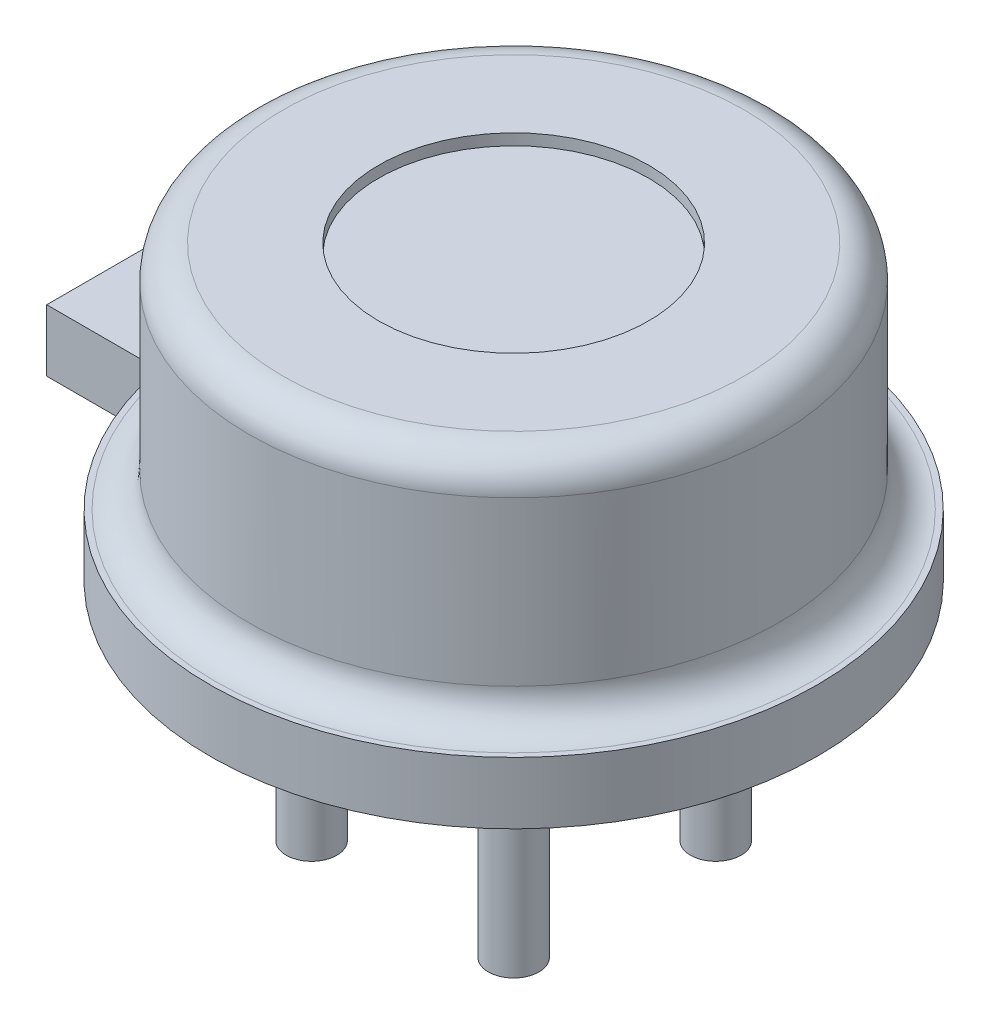
ISO-10303-21;
HEADER;
FILE_DESCRIPTION(('STEP AP214'),'2;1');
FILE_NAME('part.step','',(''),(''),'','','');
FILE_SCHEMA(('AUTOMOTIVE_DESIGN { 1 0 10303 214 1 1 1 1 }'));
ENDSEC;
DATA;
#1=APPLICATION_CONTEXT('core data for automotive mechanical design processes');
#2=APPLICATION_PROTOCOL_DEFINITION('international standard','automotive_design',2000,#1);
#3=PRODUCT_CONTEXT('',#1,'mechanical');
#4=PRODUCT('Part','Part','',(#3));
#5=PRODUCT_RELATED_PRODUCT_CATEGORY('part','',(#4));
#6=PRODUCT_DEFINITION_FORMATION('','',#4);
#7=PRODUCT_DEFINITION_CONTEXT('part definition',#1,'design');
#8=PRODUCT_DEFINITION('design','',#6,#7);
#9=PRODUCT_DEFINITION_SHAPE('','',#8);
#10=(LENGTH_UNIT() NAMED_UNIT(*) SI_UNIT(.MILLI.,.METRE.));
#11=(NAMED_UNIT(*) PLANE_ANGLE_UNIT() SI_UNIT($,.RADIAN.));
#12=(NAMED_UNIT(*) SI_UNIT($,.STERADIAN.) SOLID_ANGLE_UNIT());
#13=UNCERTAINTY_MEASURE_WITH_UNIT(LENGTH_MEASURE(1.E-05),#10,'distance_accuracy_value','');
#14=(GEOMETRIC_REPRESENTATION_CONTEXT(3) GLOBAL_UNCERTAINTY_ASSIGNED_CONTEXT((#13)) GLOBAL_UNIT_ASSIGNED_CONTEXT((#10,
#11,#12)) REPRESENTATION_CONTEXT('',''));
#15=CARTESIAN_POINT('',(0.,0.,0.));
#16=DIRECTION('',(0.,0.,1.));
#17=DIRECTION('',(1.,0.,0.));
#18=AXIS2_PLACEMENT_3D('',#15,#16,#17);
#19=CARTESIAN_POINT('',(0.,2.6,0.));
#20=DIRECTION('',(0.,-1.,0.));
#21=DIRECTION('',(0.,0.,-1.));
#22=AXIS2_PLACEMENT_3D('',#19,#20,#21);
#23=CYLINDRICAL_SURFACE('',#22,2.35);
#24=CARTESIAN_POINT('',(0.,2.3,0.));
#25=DIRECTION('',(0.,1.,0.));
#26=DIRECTION('',(0.,0.,1.));
#27=AXIS2_PLACEMENT_3D('',#24,#25,#26);
#28=CIRCLE('',#27,2.35);
#29=CARTESIAN_POINT('',(0.,2.3,2.35));
#30=VERTEX_POINT('',#29);
#31=EDGE_CURVE('E149',#30,#30,#28,.F.);
#32=ORIENTED_EDGE('',*,*,#31,.T.);
#33=EDGE_LOOP('',(#32));
#34=FACE_BOUND('',#33,.T.);
#35=CARTESIAN_POINT('',(0.,0.85,0.));
#36=DIRECTION('',(0.,-1.,0.));
#37=DIRECTION('',(0.,0.,-1.));
#38=AXIS2_PLACEMENT_3D('',#35,#36,#37);
#39=CIRCLE('',#38,2.35);
#40=CARTESIAN_POINT('',(0.,0.85,-2.35));
#41=VERTEX_POINT('',#40);
#42=EDGE_CURVE('E141',#41,#41,#39,.F.);
#43=ORIENTED_EDGE('',*,*,#42,.T.);
#44=EDGE_LOOP('',(#43));
#45=FACE_BOUND('',#44,.T.);
#46=ADVANCED_FACE('F41',(#34,#45),#23,.T.);
#47=CARTESIAN_POINT('',(0.,2.6,0.));
#48=DIRECTION('',(0.,1.,0.));
#49=DIRECTION('',(0.,0.,1.));
#50=AXIS2_PLACEMENT_3D('',#47,#48,#49);
#51=PLANE('',#50);
#52=CARTESIAN_POINT('',(0.,2.6,0.));
#53=DIRECTION('',(0.,1.,0.));
#54=DIRECTION('',(0.,0.,1.));
#55=AXIS2_PLACEMENT_3D('',#52,#53,#54);
#56=CIRCLE('',#55,1.2);
#57=CARTESIAN_POINT('',(0.,2.6,1.2));
#58=VERTEX_POINT('',#57);
#59=EDGE_CURVE('E125',#58,#58,#56,.T.);
#60=ORIENTED_EDGE('',*,*,#59,.F.);
#61=EDGE_LOOP('',(#60));
#62=FACE_BOUND('',#61,.T.);
#63=CARTESIAN_POINT('',(0.,2.6,0.));
#64=DIRECTION('',(0.,1.,0.));
#65=DIRECTION('',(0.,0.,1.));
#66=AXIS2_PLACEMENT_3D('',#63,#64,#65);
#67=CIRCLE('',#66,2.05);
#68=CARTESIAN_POINT('',(0.,2.6,2.05));
#69=VERTEX_POINT('',#68);
#70=EDGE_CURVE('E145',#69,#69,#67,.T.);
#71=ORIENTED_EDGE('',*,*,#70,.T.);
#72=EDGE_LOOP('',(#71));
#73=FACE_BOUND('',#72,.T.);
#74=ADVANCED_FACE('F192',(#62,#73),#51,.T.);
#75=CARTESIAN_POINT('',(0.,0.55,0.));
#76=DIRECTION('',(0.,-1.,0.));
#77=DIRECTION('',(0.,0.,-1.));
#78=AXIS2_PLACEMENT_3D('',#75,#76,#77);
#79=CYLINDRICAL_SURFACE('',#78,2.7);
#80=DIRECTION('',(0.,-1.,0.));
#81=VECTOR('',#80,1.);
#82=CARTESIAN_POINT('',(-2.65329983228432,0.55,-0.5));
#83=LINE('',#82,#81);
#84=CARTESIAN_POINT('',(-2.65329983228432,0.55,-0.5));
#85=VERTEX_POINT('',#84);
#86=CARTESIAN_POINT('',(-2.65329983228432,0.,-0.5));
#87=VERTEX_POINT('',#86);
#88=EDGE_CURVE('E122',#85,#87,#83,.T.);
#89=ORIENTED_EDGE('',*,*,#88,.F.);
#90=CARTESIAN_POINT('',(0.,0.55,0.));
#91=DIRECTION('',(0.,-1.,0.));
#92=DIRECTION('',(0.,0.,-1.));
#93=AXIS2_PLACEMENT_3D('',#90,#91,#92);
#94=CIRCLE('',#93,2.7);
#95=CARTESIAN_POINT('',(-2.65329983228432,0.55,0.5));
#96=VERTEX_POINT('',#95);
#97=EDGE_CURVE('E57',#85,#96,#94,.T.);
#98=ORIENTED_EDGE('',*,*,#97,.T.);
#99=DIRECTION('',(0.,-1.,0.));
#100=VECTOR('',#99,1.);
#101=CARTESIAN_POINT('',(-2.65329983228432,0.55,0.5));
#102=LINE('',#101,#100);
#103=CARTESIAN_POINT('',(-2.65329983228432,0.,0.5));
#104=VERTEX_POINT('',#103);
#105=EDGE_CURVE('E118',#104,#96,#102,.F.);
#106=ORIENTED_EDGE('',*,*,#105,.F.);
#107=CARTESIAN_POINT('',(0.,0.,0.));
#108=DIRECTION('',(0.,-1.,0.));
#109=DIRECTION('',(0.,0.,-1.));
#110=AXIS2_PLACEMENT_3D('',#107,#108,#109);
#111=CIRCLE('',#110,2.7);
#112=EDGE_CURVE('E62',#87,#104,#111,.T.);
#113=ORIENTED_EDGE('',*,*,#112,.F.);
#114=EDGE_LOOP('',(#89,#98,#106,#113));
#115=FACE_BOUND('',#114,.T.);
#116=ADVANCED_FACE('F198',(#115),#79,.T.);
#117=CARTESIAN_POINT('',(0.,0.55,0.));
#118=DIRECTION('',(0.,-1.,0.));
#119=DIRECTION('',(0.,0.,-1.));
#120=AXIS2_PLACEMENT_3D('',#117,#118,#119);
#121=PLANE('',#120);
#122=CARTESIAN_POINT('',(0.,0.55,0.));
#123=DIRECTION('',(0.,-1.,0.));
#124=DIRECTION('',(0.,0.,-1.));
#125=AXIS2_PLACEMENT_3D('',#122,#123,#124);
#126=CIRCLE('',#125,2.65);
#127=CARTESIAN_POINT('',(0.,0.55,-2.65));
#128=VERTEX_POINT('',#127);
#129=EDGE_CURVE('E135',#128,#128,#126,.T.);
#130=ORIENTED_EDGE('',*,*,#129,.T.);
#131=EDGE_LOOP('',(#130));
#132=FACE_BOUND('',#131,.T.);
#133=ORIENTED_EDGE('',*,*,#97,.F.);
#134=DIRECTION('',(-1.,0.,0.));
#135=VECTOR('',#134,1.);
#136=CARTESIAN_POINT('',(-2.5,0.55,-0.5));
#137=LINE('',#136,#135);
#138=CARTESIAN_POINT('',(-3.65,0.55,-0.500000000000001));
#139=VERTEX_POINT('',#138);
#140=EDGE_CURVE('E119',#85,#139,#137,.T.);
#141=ORIENTED_EDGE('',*,*,#140,.T.);
#142=DIRECTION('',(0.,0.,1.));
#143=VECTOR('',#142,1.);
#144=CARTESIAN_POINT('',(-3.65,0.55,0.5));
#145=LINE('',#144,#143);
#146=CARTESIAN_POINT('',(-3.65,0.55,0.5));
#147=VERTEX_POINT('',#146);
#148=EDGE_CURVE('E114',#139,#147,#145,.T.);
#149=ORIENTED_EDGE('',*,*,#148,.T.);
#150=DIRECTION('',(1.,0.,0.));
#151=VECTOR('',#150,1.);
#152=CARTESIAN_POINT('',(-2.5,0.55,0.5));
#153=LINE('',#152,#151);
#154=EDGE_CURVE('E98',#147,#96,#153,.T.);
#155=ORIENTED_EDGE('',*,*,#154,.T.);
#156=EDGE_LOOP('',(#133,#141,#149,#155));
#157=FACE_BOUND('',#156,.T.);
#158=ADVANCED_FACE('F169',(#132,#157),#121,.F.);
#159=CARTESIAN_POINT('',(0.,0.,0.));
#160=DIRECTION('',(0.,1.,0.));
#161=DIRECTION('',(0.,0.,1.));
#162=AXIS2_PLACEMENT_3D('',#159,#160,#161);
#163=PLANE('',#162);
#164=CARTESIAN_POINT('',(0.898025612106914,0.,-0.898025612106917));
#165=DIRECTION('',(0.,1.,0.));
#166=DIRECTION('',(0.,0.,1.));
#167=AXIS2_PLACEMENT_3D('',#164,#165,#166);
#168=CIRCLE('',#167,0.225);
#169=CARTESIAN_POINT('',(0.898025612106914,0.,-0.673025612106917));
#170=VERTEX_POINT('',#169);
#171=EDGE_CURVE('E11',#170,#170,#168,.F.);
#172=ORIENTED_EDGE('',*,*,#171,.F.);
#173=EDGE_LOOP('',(#172));
#174=FACE_BOUND('',#173,.T.);
#175=CARTESIAN_POINT('',(-0.89802561210692,0.,-0.898025612106911));
#176=DIRECTION('',(0.,1.,0.));
#177=DIRECTION('',(0.,0.,1.));
#178=AXIS2_PLACEMENT_3D('',#175,#176,#177);
#179=CIRCLE('',#178,0.225);
#180=CARTESIAN_POINT('',(-0.89802561210692,0.,-0.673025612106911));
#181=VERTEX_POINT('',#180);
#182=EDGE_CURVE('E50',#181,#181,#179,.F.);
#183=ORIENTED_EDGE('',*,*,#182,.F.);
#184=EDGE_LOOP('',(#183));
#185=FACE_BOUND('',#184,.T.);
#186=CARTESIAN_POINT('',(0.898025612106914,0.,0.898025612106917));
#187=DIRECTION('',(0.,1.,0.));
#188=DIRECTION('',(0.,0.,1.));
#189=AXIS2_PLACEMENT_3D('',#186,#187,#188);
#190=CIRCLE('',#189,0.225);
#191=CARTESIAN_POINT('',(0.898025612106914,0.,1.12302561210692));
#192=VERTEX_POINT('',#191);
#193=EDGE_CURVE('E157',#192,#192,#190,.F.);
#194=ORIENTED_EDGE('',*,*,#193,.F.);
#195=EDGE_LOOP('',(#194));
#196=FACE_BOUND('',#195,.T.);
#197=CARTESIAN_POINT('',(-0.89802561210692,0.,0.89802561210691));
#198=DIRECTION('',(0.,1.,0.));
#199=DIRECTION('',(0.,0.,1.));
#200=AXIS2_PLACEMENT_3D('',#197,#198,#199);
#201=CIRCLE('',#200,0.225);
#202=CARTESIAN_POINT('',(-0.89802561210692,0.,1.12302561210691));
#203=VERTEX_POINT('',#202);
#204=EDGE_CURVE('E153',#203,#203,#201,.F.);
#205=ORIENTED_EDGE('',*,*,#204,.F.);
#206=EDGE_LOOP('',(#205));
#207=FACE_BOUND('',#206,.T.);
#208=ORIENTED_EDGE('',*,*,#112,.T.);
#209=DIRECTION('',(-1.,0.,0.));
#210=VECTOR('',#209,1.);
#211=CARTESIAN_POINT('',(-2.5,0.,0.5));
#212=LINE('',#211,#210);
#213=CARTESIAN_POINT('',(-3.65,0.,0.5));
#214=VERTEX_POINT('',#213);
#215=EDGE_CURVE('E82',#104,#214,#212,.T.);
#216=ORIENTED_EDGE('',*,*,#215,.T.);
#217=DIRECTION('',(0.,0.,-1.));
#218=VECTOR('',#217,1.);
#219=CARTESIAN_POINT('',(-3.65,0.,0.5));
#220=LINE('',#219,#218);
#221=CARTESIAN_POINT('',(-3.65,0.,-0.5));
#222=VERTEX_POINT('',#221);
#223=EDGE_CURVE('E87',#214,#222,#220,.T.);
#224=ORIENTED_EDGE('',*,*,#223,.T.);
#225=DIRECTION('',(1.,0.,0.));
#226=VECTOR('',#225,1.);
#227=CARTESIAN_POINT('',(-2.5,0.,-0.5));
#228=LINE('',#227,#226);
#229=EDGE_CURVE('E103',#222,#87,#228,.T.);
#230=ORIENTED_EDGE('',*,*,#229,.T.);
#231=EDGE_LOOP('',(#208,#216,#224,#230));
#232=FACE_BOUND('',#231,.T.);
#233=ADVANCED_FACE('F84',(#174,#185,#196,#207,#232),#163,.F.);
#234=CARTESIAN_POINT('',(0.,0.85,0.));
#235=DIRECTION('',(0.,-1.,0.));
#236=DIRECTION('',(0.,0.,-1.));
#237=AXIS2_PLACEMENT_3D('',#234,#235,#236);
#238=TOROIDAL_SURFACE('',#237,2.65,0.3);
#239=ORIENTED_EDGE('',*,*,#42,.F.);
#240=EDGE_LOOP('',(#239));
#241=FACE_BOUND('',#240,.T.);
#242=ORIENTED_EDGE('',*,*,#129,.F.);
#243=EDGE_LOOP('',(#242));
#244=FACE_BOUND('',#243,.T.);
#245=ADVANCED_FACE('F168',(#241,#244),#238,.F.);
#246=CARTESIAN_POINT('',(0.,2.3,0.));
#247=DIRECTION('',(0.,1.,0.));
#248=DIRECTION('',(0.,0.,1.));
#249=AXIS2_PLACEMENT_3D('',#246,#247,#248);
#250=TOROIDAL_SURFACE('',#249,2.05,0.3);
#251=ORIENTED_EDGE('',*,*,#31,.F.);
#252=EDGE_LOOP('',(#251));
#253=FACE_BOUND('',#252,.T.);
#254=ORIENTED_EDGE('',*,*,#70,.F.);
#255=EDGE_LOOP('',(#254));
#256=FACE_BOUND('',#255,.T.);
#257=ADVANCED_FACE('F43',(#253,#256),#250,.T.);
#258=CARTESIAN_POINT('',(0.,2.5,0.));
#259=DIRECTION('',(0.,1.,0.));
#260=DIRECTION('',(0.,0.,1.));
#261=AXIS2_PLACEMENT_3D('',#258,#259,#260);
#262=CYLINDRICAL_SURFACE('',#261,1.2);
#263=CARTESIAN_POINT('',(0.,2.5,0.));
#264=DIRECTION('',(0.,1.,0.));
#265=DIRECTION('',(0.,0.,1.));
#266=AXIS2_PLACEMENT_3D('',#263,#264,#265);
#267=CIRCLE('',#266,1.2);
#268=CARTESIAN_POINT('',(0.,2.5,1.2));
#269=VERTEX_POINT('',#268);
#270=EDGE_CURVE('E126',#269,#269,#267,.T.);
#271=ORIENTED_EDGE('',*,*,#270,.F.);
#272=EDGE_LOOP('',(#271));
#273=FACE_BOUND('',#272,.T.);
#274=ORIENTED_EDGE('',*,*,#59,.T.);
#275=EDGE_LOOP('',(#274));
#276=FACE_BOUND('',#275,.T.);
#277=ADVANCED_FACE('F207',(#273,#276),#262,.F.);
#278=CARTESIAN_POINT('',(0.,2.5,0.));
#279=DIRECTION('',(0.,1.,0.));
#280=DIRECTION('',(0.,0.,1.));
#281=AXIS2_PLACEMENT_3D('',#278,#279,#280);
#282=PLANE('',#281);
#283=ORIENTED_EDGE('',*,*,#270,.T.);
#284=EDGE_LOOP('',(#283));
#285=FACE_BOUND('',#284,.T.);
#286=ADVANCED_FACE('F329',(#285),#282,.T.);
#287=CARTESIAN_POINT('',(-2.5,2.07397506541282,-0.5));
#288=DIRECTION('',(0.,0.,-1.));
#289=DIRECTION('',(-1.,0.,0.));
#290=AXIS2_PLACEMENT_3D('',#287,#288,#289);
#291=PLANE('',#290);
#292=ORIENTED_EDGE('',*,*,#140,.F.);
#293=ORIENTED_EDGE('',*,*,#88,.T.);
#294=ORIENTED_EDGE('',*,*,#229,.F.);
#295=DIRECTION('',(0.,-1.,0.));
#296=VECTOR('',#295,1.);
#297=CARTESIAN_POINT('',(-3.65,2.07397506541282,-0.5));
#298=LINE('',#297,#296);
#299=EDGE_CURVE('E102',#139,#222,#298,.T.);
#300=ORIENTED_EDGE('',*,*,#299,.F.);
#301=EDGE_LOOP('',(#292,#293,#294,#300));
#302=FACE_BOUND('',#301,.T.);
#303=ADVANCED_FACE('F218',(#302),#291,.T.);
#304=CARTESIAN_POINT('',(-3.65,2.07397506541282,0.5));
#305=DIRECTION('',(-1.,0.,0.));
#306=DIRECTION('',(0.,0.,1.));
#307=AXIS2_PLACEMENT_3D('',#304,#305,#306);
#308=PLANE('',#307);
#309=ORIENTED_EDGE('',*,*,#148,.F.);
#310=ORIENTED_EDGE('',*,*,#299,.T.);
#311=ORIENTED_EDGE('',*,*,#223,.F.);
#312=DIRECTION('',(0.,-1.,0.));
#313=VECTOR('',#312,1.);
#314=CARTESIAN_POINT('',(-3.65,2.07397506541282,0.5));
#315=LINE('',#314,#313);
#316=EDGE_CURVE('E95',#147,#214,#315,.T.);
#317=ORIENTED_EDGE('',*,*,#316,.F.);
#318=EDGE_LOOP('',(#309,#310,#311,#317));
#319=FACE_BOUND('',#318,.T.);
#320=ADVANCED_FACE('F105',(#319),#308,.T.);
#321=CARTESIAN_POINT('',(-2.5,2.07397506541282,0.5));
#322=DIRECTION('',(0.,0.,1.));
#323=DIRECTION('',(1.,0.,0.));
#324=AXIS2_PLACEMENT_3D('',#321,#322,#323);
#325=PLANE('',#324);
#326=ORIENTED_EDGE('',*,*,#215,.F.);
#327=ORIENTED_EDGE('',*,*,#105,.T.);
#328=ORIENTED_EDGE('',*,*,#154,.F.);
#329=ORIENTED_EDGE('',*,*,#316,.T.);
#330=EDGE_LOOP('',(#326,#327,#328,#329));
#331=FACE_BOUND('',#330,.T.);
#332=ADVANCED_FACE('F96',(#331),#325,.T.);
#333=CARTESIAN_POINT('',(-0.89802561210692,-2.,0.89802561210691));
#334=DIRECTION('',(0.,1.,0.));
#335=DIRECTION('',(0.,0.,1.));
#336=AXIS2_PLACEMENT_3D('',#333,#334,#335);
#337=CYLINDRICAL_SURFACE('',#336,0.225);
#338=CARTESIAN_POINT('',(-0.89802561210692,-2.,0.89802561210691));
#339=DIRECTION('',(0.,-1.,0.));
#340=DIRECTION('',(0.,0.,-1.));
#341=AXIS2_PLACEMENT_3D('',#338,#339,#340);
#342=CIRCLE('',#341,0.225);
#343=CARTESIAN_POINT('',(-0.89802561210692,-2.,0.67302561210691));
#344=VERTEX_POINT('',#343);
#345=EDGE_CURVE('E91',#344,#344,#342,.T.);
#346=ORIENTED_EDGE('',*,*,#345,.F.);
#347=EDGE_LOOP('',(#346));
#348=FACE_BOUND('',#347,.T.);
#349=ORIENTED_EDGE('',*,*,#204,.T.);
#350=EDGE_LOOP('',(#349));
#351=FACE_BOUND('',#350,.T.);
#352=ADVANCED_FACE('F176',(#348,#351),#337,.T.);
#353=CARTESIAN_POINT('',(-0.89802561210692,-2.,0.89802561210691));
#354=DIRECTION('',(0.,-1.,0.));
#355=DIRECTION('',(0.,0.,-1.));
#356=AXIS2_PLACEMENT_3D('',#353,#354,#355);
#357=PLANE('',#356);
#358=ORIENTED_EDGE('',*,*,#345,.T.);
#359=EDGE_LOOP('',(#358));
#360=FACE_BOUND('',#359,.T.);
#361=ADVANCED_FACE('F178',(#360),#357,.T.);
#362=CARTESIAN_POINT('',(0.898025612106914,-2.,0.898025612106917));
#363=DIRECTION('',(0.,1.,0.));
#364=DIRECTION('',(0.,0.,1.));
#365=AXIS2_PLACEMENT_3D('',#362,#363,#364);
#366=CYLINDRICAL_SURFACE('',#365,0.225);
#367=CARTESIAN_POINT('',(0.898025612106914,-2.,0.898025612106917));
#368=DIRECTION('',(0.,-1.,0.));
#369=DIRECTION('',(0.,0.,-1.));
#370=AXIS2_PLACEMENT_3D('',#367,#368,#369);
#371=CIRCLE('',#370,0.225);
#372=CARTESIAN_POINT('',(0.898025612106914,-2.,0.673025612106917));
#373=VERTEX_POINT('',#372);
#374=EDGE_CURVE('E226',#373,#373,#371,.T.);
#375=ORIENTED_EDGE('',*,*,#374,.F.);
#376=EDGE_LOOP('',(#375));
#377=FACE_BOUND('',#376,.T.);
#378=ORIENTED_EDGE('',*,*,#193,.T.);
#379=EDGE_LOOP('',(#378));
#380=FACE_BOUND('',#379,.T.);
#381=ADVANCED_FACE('F185',(#377,#380),#366,.T.);
#382=CARTESIAN_POINT('',(0.898025612106914,-2.,0.898025612106917));
#383=DIRECTION('',(0.,-1.,0.));
#384=DIRECTION('',(0.,0.,-1.));
#385=AXIS2_PLACEMENT_3D('',#382,#383,#384);
#386=PLANE('',#385);
#387=ORIENTED_EDGE('',*,*,#374,.T.);
#388=EDGE_LOOP('',(#387));
#389=FACE_BOUND('',#388,.T.);
#390=ADVANCED_FACE('F257',(#389),#386,.T.);
#391=CARTESIAN_POINT('',(-0.89802561210692,-2.,-0.898025612106911));
#392=DIRECTION('',(0.,1.,0.));
#393=DIRECTION('',(0.,0.,1.));
#394=AXIS2_PLACEMENT_3D('',#391,#392,#393);
#395=CYLINDRICAL_SURFACE('',#394,0.225);
#396=CARTESIAN_POINT('',(-0.89802561210692,-2.,-0.898025612106911));
#397=DIRECTION('',(0.,-1.,0.));
#398=DIRECTION('',(0.,0.,-1.));
#399=AXIS2_PLACEMENT_3D('',#396,#397,#398);
#400=CIRCLE('',#399,0.225);
#401=CARTESIAN_POINT('',(-0.89802561210692,-2.,-1.12302561210691));
#402=VERTEX_POINT('',#401);
#403=EDGE_CURVE('E230',#402,#402,#400,.T.);
#404=ORIENTED_EDGE('',*,*,#403,.F.);
#405=EDGE_LOOP('',(#404));
#406=FACE_BOUND('',#405,.T.);
#407=ORIENTED_EDGE('',*,*,#182,.T.);
#408=EDGE_LOOP('',(#407));
#409=FACE_BOUND('',#408,.T.);
#410=ADVANCED_FACE('F164',(#406,#409),#395,.T.);
#411=CARTESIAN_POINT('',(-0.89802561210692,-2.,-0.898025612106911));
#412=DIRECTION('',(0.,-1.,0.));
#413=DIRECTION('',(0.,0.,-1.));
#414=AXIS2_PLACEMENT_3D('',#411,#412,#413);
#415=PLANE('',#414);
#416=ORIENTED_EDGE('',*,*,#403,.T.);
#417=EDGE_LOOP('',(#416));
#418=FACE_BOUND('',#417,.T.);
#419=ADVANCED_FACE('F244',(#418),#415,.T.);
#420=CARTESIAN_POINT('',(0.898025612106914,-2.,-0.898025612106917));
#421=DIRECTION('',(0.,1.,0.));
#422=DIRECTION('',(0.,0.,1.));
#423=AXIS2_PLACEMENT_3D('',#420,#421,#422);
#424=CYLINDRICAL_SURFACE('',#423,0.225);
#425=CARTESIAN_POINT('',(0.898025612106914,-2.,-0.898025612106917));
#426=DIRECTION('',(0.,-1.,0.));
#427=DIRECTION('',(0.,0.,-1.));
#428=AXIS2_PLACEMENT_3D('',#425,#426,#427);
#429=CIRCLE('',#428,0.225);
#430=CARTESIAN_POINT('',(0.898025612106914,-2.,-1.12302561210692));
#431=VERTEX_POINT('',#430);
#432=EDGE_CURVE('E234',#431,#431,#429,.T.);
#433=ORIENTED_EDGE('',*,*,#432,.F.);
#434=EDGE_LOOP('',(#433));
#435=FACE_BOUND('',#434,.T.);
#436=ORIENTED_EDGE('',*,*,#171,.T.);
#437=EDGE_LOOP('',(#436));
#438=FACE_BOUND('',#437,.T.);
#439=ADVANCED_FACE('F241',(#435,#438),#424,.T.);
#440=CARTESIAN_POINT('',(0.898025612106914,-2.,-0.898025612106917));
#441=DIRECTION('',(0.,-1.,0.));
#442=DIRECTION('',(0.,0.,-1.));
#443=AXIS2_PLACEMENT_3D('',#440,#441,#442);
#444=PLANE('',#443);
#445=ORIENTED_EDGE('',*,*,#432,.T.);
#446=EDGE_LOOP('',(#445));
#447=FACE_BOUND('',#446,.T.);
#448=ADVANCED_FACE('F239',(#447),#444,.T.);
#449=CLOSED_SHELL('',(#46,#74,#116,#158,#233,#245,#257,#277,#286,#303,#320,#332,#352,#361,#381,
#390,#410,#419,#439,#448));
#450=MANIFOLD_SOLID_BREP('B2',#449);
#451=ADVANCED_BREP_SHAPE_REPRESENTATION('',(#18,#450),#14);
#452=SHAPE_DEFINITION_REPRESENTATION(#9,#451);
ENDSEC;
END-ISO-10303-21;
